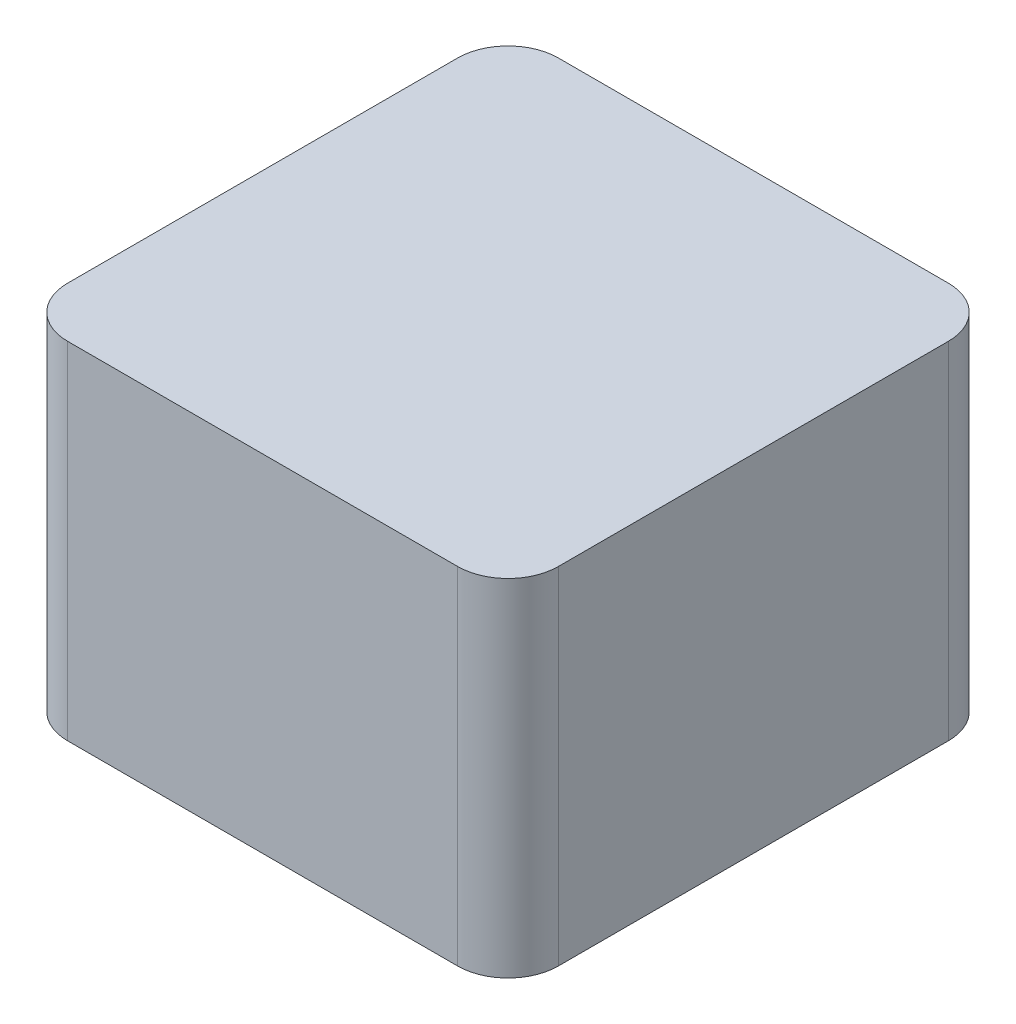
ISO-10303-21;
HEADER;
FILE_DESCRIPTION(('STEP AP214'),'2;1');
FILE_NAME('part.step','',(''),(''),'','','');
FILE_SCHEMA(('AUTOMOTIVE_DESIGN { 1 0 10303 214 1 1 1 1 }'));
ENDSEC;
DATA;
#1=APPLICATION_CONTEXT('core data for automotive mechanical design processes');
#2=APPLICATION_PROTOCOL_DEFINITION('international standard','automotive_design',2000,#1);
#3=PRODUCT_CONTEXT('',#1,'mechanical');
#4=PRODUCT('Part','Part','',(#3));
#5=PRODUCT_RELATED_PRODUCT_CATEGORY('part','',(#4));
#6=PRODUCT_DEFINITION_FORMATION('','',#4);
#7=PRODUCT_DEFINITION_CONTEXT('part definition',#1,'design');
#8=PRODUCT_DEFINITION('design','',#6,#7);
#9=PRODUCT_DEFINITION_SHAPE('','',#8);
#10=(LENGTH_UNIT() NAMED_UNIT(*) SI_UNIT(.MILLI.,.METRE.));
#11=(NAMED_UNIT(*) PLANE_ANGLE_UNIT() SI_UNIT($,.RADIAN.));
#12=(NAMED_UNIT(*) SI_UNIT($,.STERADIAN.) SOLID_ANGLE_UNIT());
#13=UNCERTAINTY_MEASURE_WITH_UNIT(LENGTH_MEASURE(1.E-05),#10,'distance_accuracy_value','');
#14=(GEOMETRIC_REPRESENTATION_CONTEXT(3) GLOBAL_UNCERTAINTY_ASSIGNED_CONTEXT((#13)) GLOBAL_UNIT_ASSIGNED_CONTEXT((#10,
#11,#12)) REPRESENTATION_CONTEXT('',''));
#15=CARTESIAN_POINT('',(0.,0.,0.));
#16=DIRECTION('',(0.,0.,1.));
#17=DIRECTION('',(1.,0.,0.));
#18=AXIS2_PLACEMENT_3D('',#15,#16,#17);
#19=CARTESIAN_POINT('',(81.7763790889018,128.224152421526,210.74612664294));
#20=DIRECTION('',(0.,-1.,0.));
#21=DIRECTION('',(0.,0.,-1.));
#22=AXIS2_PLACEMENT_3D('',#19,#20,#21);
#23=CYLINDRICAL_SURFACE('',#22,0.799999999999995);
#24=CARTESIAN_POINT('',(81.7763790889018,122.724152421526,210.74612664294));
#25=DIRECTION('',(0.,-1.,0.));
#26=DIRECTION('',(0.,0.,-1.));
#27=AXIS2_PLACEMENT_3D('',#24,#25,#26);
#28=CIRCLE('',#27,0.799999999999995);
#29=CARTESIAN_POINT('',(80.9763790889018,122.724152421526,210.74612664294));
#30=VERTEX_POINT('',#29);
#31=CARTESIAN_POINT('',(81.7763790889018,122.724152421526,209.94612664294));
#32=VERTEX_POINT('',#31);
#33=EDGE_CURVE('E142',#30,#32,#28,.T.);
#34=ORIENTED_EDGE('',*,*,#33,.F.);
#35=DIRECTION('',(0.,-1.,0.));
#36=VECTOR('',#35,1.);
#37=CARTESIAN_POINT('',(80.9763790889018,128.224152421526,210.74612664294));
#38=LINE('',#37,#36);
#39=CARTESIAN_POINT('',(80.9763790889018,128.224152421526,210.74612664294));
#40=VERTEX_POINT('',#39);
#41=EDGE_CURVE('E11',#40,#30,#38,.T.);
#42=ORIENTED_EDGE('',*,*,#41,.F.);
#43=CARTESIAN_POINT('',(81.7763790889018,128.224152421526,210.74612664294));
#44=DIRECTION('',(0.,-1.,0.));
#45=DIRECTION('',(0.,0.,-1.));
#46=AXIS2_PLACEMENT_3D('',#43,#44,#45);
#47=CIRCLE('',#46,0.799999999999995);
#48=CARTESIAN_POINT('',(81.7763790889018,128.224152421526,209.94612664294));
#49=VERTEX_POINT('',#48);
#50=EDGE_CURVE('E170',#40,#49,#47,.T.);
#51=ORIENTED_EDGE('',*,*,#50,.T.);
#52=DIRECTION('',(0.,-1.,0.));
#53=VECTOR('',#52,1.);
#54=CARTESIAN_POINT('',(81.7763790889018,128.224152421526,209.94612664294));
#55=LINE('',#54,#53);
#56=EDGE_CURVE('E42',#49,#32,#55,.T.);
#57=ORIENTED_EDGE('',*,*,#56,.T.);
#58=EDGE_LOOP('',(#34,#42,#51,#57));
#59=FACE_BOUND('',#58,.T.);
#60=ADVANCED_FACE('F39',(#59),#23,.T.);
#61=CARTESIAN_POINT('',(80.9763790889018,128.224152421526,210.74612664294));
#62=DIRECTION('',(-1.,0.,0.));
#63=DIRECTION('',(0.,0.,1.));
#64=AXIS2_PLACEMENT_3D('',#61,#62,#63);
#65=PLANE('',#64);
#66=DIRECTION('',(0.,0.,-1.));
#67=VECTOR('',#66,1.);
#68=CARTESIAN_POINT('',(80.9763790889018,122.724152421526,210.74612664294));
#69=LINE('',#68,#67);
#70=CARTESIAN_POINT('',(80.9763790889018,122.724152421526,216.94612664294));
#71=VERTEX_POINT('',#70);
#72=EDGE_CURVE('E167',#71,#30,#69,.T.);
#73=ORIENTED_EDGE('',*,*,#72,.F.);
#74=DIRECTION('',(0.,-1.,0.));
#75=VECTOR('',#74,1.);
#76=CARTESIAN_POINT('',(80.9763790889018,128.224152421526,216.94612664294));
#77=LINE('',#76,#75);
#78=CARTESIAN_POINT('',(80.9763790889018,128.224152421526,216.94612664294));
#79=VERTEX_POINT('',#78);
#80=EDGE_CURVE('E49',#79,#71,#77,.T.);
#81=ORIENTED_EDGE('',*,*,#80,.F.);
#82=DIRECTION('',(0.,0.,-1.));
#83=VECTOR('',#82,1.);
#84=CARTESIAN_POINT('',(80.9763790889018,128.224152421526,210.74612664294));
#85=LINE('',#84,#83);
#86=EDGE_CURVE('E128',#79,#40,#85,.T.);
#87=ORIENTED_EDGE('',*,*,#86,.T.);
#88=ORIENTED_EDGE('',*,*,#41,.T.);
#89=EDGE_LOOP('',(#73,#81,#87,#88));
#90=FACE_BOUND('',#89,.T.);
#91=ADVANCED_FACE('F188',(#90),#65,.T.);
#92=CARTESIAN_POINT('',(81.7763790889017,128.224152421526,216.94612664294));
#93=DIRECTION('',(0.,-1.,0.));
#94=DIRECTION('',(0.,0.,-1.));
#95=AXIS2_PLACEMENT_3D('',#92,#93,#94);
#96=CYLINDRICAL_SURFACE('',#95,0.799999999999988);
#97=CARTESIAN_POINT('',(81.7763790889017,122.724152421526,216.94612664294));
#98=DIRECTION('',(0.,-1.,0.));
#99=DIRECTION('',(0.,0.,-1.));
#100=AXIS2_PLACEMENT_3D('',#97,#98,#99);
#101=CIRCLE('',#100,0.799999999999988);
#102=CARTESIAN_POINT('',(81.7763790889017,122.724152421526,217.74612664294));
#103=VERTEX_POINT('',#102);
#104=EDGE_CURVE('E114',#103,#71,#101,.T.);
#105=ORIENTED_EDGE('',*,*,#104,.F.);
#106=DIRECTION('',(0.,-1.,0.));
#107=VECTOR('',#106,1.);
#108=CARTESIAN_POINT('',(81.7763790889017,128.224152421526,217.74612664294));
#109=LINE('',#108,#107);
#110=CARTESIAN_POINT('',(81.7763790889017,128.224152421526,217.74612664294));
#111=VERTEX_POINT('',#110);
#112=EDGE_CURVE('E109',#111,#103,#109,.T.);
#113=ORIENTED_EDGE('',*,*,#112,.F.);
#114=CARTESIAN_POINT('',(81.7763790889017,128.224152421526,216.94612664294));
#115=DIRECTION('',(0.,-1.,0.));
#116=DIRECTION('',(0.,0.,-1.));
#117=AXIS2_PLACEMENT_3D('',#114,#115,#116);
#118=CIRCLE('',#117,0.799999999999988);
#119=EDGE_CURVE('E112',#111,#79,#118,.T.);
#120=ORIENTED_EDGE('',*,*,#119,.T.);
#121=ORIENTED_EDGE('',*,*,#80,.T.);
#122=EDGE_LOOP('',(#105,#113,#120,#121));
#123=FACE_BOUND('',#122,.T.);
#124=ADVANCED_FACE('F111',(#123),#96,.T.);
#125=CARTESIAN_POINT('',(81.7763790889017,128.224152421526,217.74612664294));
#126=DIRECTION('',(0.,0.,1.));
#127=DIRECTION('',(1.,0.,0.));
#128=AXIS2_PLACEMENT_3D('',#125,#126,#127);
#129=PLANE('',#128);
#130=DIRECTION('',(-1.,0.,0.));
#131=VECTOR('',#130,1.);
#132=CARTESIAN_POINT('',(81.7763790889017,122.724152421526,217.74612664294));
#133=LINE('',#132,#131);
#134=CARTESIAN_POINT('',(87.9763790889018,122.724152421526,217.74612664294));
#135=VERTEX_POINT('',#134);
#136=EDGE_CURVE('E162',#135,#103,#133,.T.);
#137=ORIENTED_EDGE('',*,*,#136,.F.);
#138=DIRECTION('',(0.,-1.,0.));
#139=VECTOR('',#138,1.);
#140=CARTESIAN_POINT('',(87.9763790889018,128.224152421526,217.74612664294));
#141=LINE('',#140,#139);
#142=CARTESIAN_POINT('',(87.9763790889018,128.224152421526,217.74612664294));
#143=VERTEX_POINT('',#142);
#144=EDGE_CURVE('E120',#143,#135,#141,.T.);
#145=ORIENTED_EDGE('',*,*,#144,.F.);
#146=DIRECTION('',(-1.,0.,0.));
#147=VECTOR('',#146,1.);
#148=CARTESIAN_POINT('',(81.7763790889017,128.224152421526,217.74612664294));
#149=LINE('',#148,#147);
#150=EDGE_CURVE('E126',#143,#111,#149,.T.);
#151=ORIENTED_EDGE('',*,*,#150,.T.);
#152=ORIENTED_EDGE('',*,*,#112,.T.);
#153=EDGE_LOOP('',(#137,#145,#151,#152));
#154=FACE_BOUND('',#153,.T.);
#155=ADVANCED_FACE('F131',(#154),#129,.T.);
#156=CARTESIAN_POINT('',(87.9763790889018,128.224152421526,216.94612664294));
#157=DIRECTION('',(0.,-1.,0.));
#158=DIRECTION('',(0.,0.,-1.));
#159=AXIS2_PLACEMENT_3D('',#156,#157,#158);
#160=CYLINDRICAL_SURFACE('',#159,0.799999999999995);
#161=CARTESIAN_POINT('',(87.9763790889018,122.724152421526,216.94612664294));
#162=DIRECTION('',(0.,-1.,0.));
#163=DIRECTION('',(0.,0.,-1.));
#164=AXIS2_PLACEMENT_3D('',#161,#162,#163);
#165=CIRCLE('',#164,0.799999999999995);
#166=CARTESIAN_POINT('',(88.7763790889017,122.724152421526,216.94612664294));
#167=VERTEX_POINT('',#166);
#168=EDGE_CURVE('E158',#167,#135,#165,.T.);
#169=ORIENTED_EDGE('',*,*,#168,.F.);
#170=DIRECTION('',(0.,-1.,0.));
#171=VECTOR('',#170,1.);
#172=CARTESIAN_POINT('',(88.7763790889017,128.224152421526,216.94612664294));
#173=LINE('',#172,#171);
#174=CARTESIAN_POINT('',(88.7763790889017,128.224152421526,216.94612664294));
#175=VERTEX_POINT('',#174);
#176=EDGE_CURVE('E176',#175,#167,#173,.T.);
#177=ORIENTED_EDGE('',*,*,#176,.F.);
#178=CARTESIAN_POINT('',(87.9763790889018,128.224152421526,216.94612664294));
#179=DIRECTION('',(0.,-1.,0.));
#180=DIRECTION('',(0.,0.,-1.));
#181=AXIS2_PLACEMENT_3D('',#178,#179,#180);
#182=CIRCLE('',#181,0.799999999999995);
#183=EDGE_CURVE('E133',#175,#143,#182,.T.);
#184=ORIENTED_EDGE('',*,*,#183,.T.);
#185=ORIENTED_EDGE('',*,*,#144,.T.);
#186=EDGE_LOOP('',(#169,#177,#184,#185));
#187=FACE_BOUND('',#186,.T.);
#188=ADVANCED_FACE('F201',(#187),#160,.T.);
#189=CARTESIAN_POINT('',(88.7763790889017,128.224152421526,216.94612664294));
#190=DIRECTION('',(1.,0.,0.));
#191=DIRECTION('',(0.,0.,-1.));
#192=AXIS2_PLACEMENT_3D('',#189,#190,#191);
#193=PLANE('',#192);
#194=DIRECTION('',(0.,0.,1.));
#195=VECTOR('',#194,1.);
#196=CARTESIAN_POINT('',(88.7763790889017,122.724152421526,216.94612664294));
#197=LINE('',#196,#195);
#198=CARTESIAN_POINT('',(88.7763790889017,122.724152421526,210.74612664294));
#199=VERTEX_POINT('',#198);
#200=EDGE_CURVE('E154',#199,#167,#197,.T.);
#201=ORIENTED_EDGE('',*,*,#200,.F.);
#202=DIRECTION('',(0.,-1.,0.));
#203=VECTOR('',#202,1.);
#204=CARTESIAN_POINT('',(88.7763790889017,128.224152421526,210.74612664294));
#205=LINE('',#204,#203);
#206=CARTESIAN_POINT('',(88.7763790889017,128.224152421526,210.74612664294));
#207=VERTEX_POINT('',#206);
#208=EDGE_CURVE('E179',#207,#199,#205,.T.);
#209=ORIENTED_EDGE('',*,*,#208,.F.);
#210=DIRECTION('',(0.,0.,1.));
#211=VECTOR('',#210,1.);
#212=CARTESIAN_POINT('',(88.7763790889017,128.224152421526,216.94612664294));
#213=LINE('',#212,#211);
#214=EDGE_CURVE('E136',#207,#175,#213,.T.);
#215=ORIENTED_EDGE('',*,*,#214,.T.);
#216=ORIENTED_EDGE('',*,*,#176,.T.);
#217=EDGE_LOOP('',(#201,#209,#215,#216));
#218=FACE_BOUND('',#217,.T.);
#219=ADVANCED_FACE('F204',(#218),#193,.T.);
#220=CARTESIAN_POINT('',(87.9763790889017,128.224152421526,210.74612664294));
#221=DIRECTION('',(0.,-1.,0.));
#222=DIRECTION('',(0.,0.,-1.));
#223=AXIS2_PLACEMENT_3D('',#220,#221,#222);
#224=CYLINDRICAL_SURFACE('',#223,0.799999999999995);
#225=CARTESIAN_POINT('',(87.9763790889017,122.724152421526,210.74612664294));
#226=DIRECTION('',(0.,-1.,0.));
#227=DIRECTION('',(0.,0.,-1.));
#228=AXIS2_PLACEMENT_3D('',#225,#226,#227);
#229=CIRCLE('',#228,0.799999999999995);
#230=CARTESIAN_POINT('',(87.9763790889017,122.724152421526,209.94612664294));
#231=VERTEX_POINT('',#230);
#232=EDGE_CURVE('E150',#231,#199,#229,.T.);
#233=ORIENTED_EDGE('',*,*,#232,.F.);
#234=DIRECTION('',(0.,-1.,0.));
#235=VECTOR('',#234,1.);
#236=CARTESIAN_POINT('',(87.9763790889017,128.224152421526,209.94612664294));
#237=LINE('',#236,#235);
#238=CARTESIAN_POINT('',(87.9763790889017,128.224152421526,209.94612664294));
#239=VERTEX_POINT('',#238);
#240=EDGE_CURVE('E181',#239,#231,#237,.T.);
#241=ORIENTED_EDGE('',*,*,#240,.F.);
#242=CARTESIAN_POINT('',(87.9763790889017,128.224152421526,210.74612664294));
#243=DIRECTION('',(0.,-1.,0.));
#244=DIRECTION('',(0.,0.,-1.));
#245=AXIS2_PLACEMENT_3D('',#242,#243,#244);
#246=CIRCLE('',#245,0.799999999999995);
#247=EDGE_CURVE('E279',#239,#207,#246,.T.);
#248=ORIENTED_EDGE('',*,*,#247,.T.);
#249=ORIENTED_EDGE('',*,*,#208,.T.);
#250=EDGE_LOOP('',(#233,#241,#248,#249));
#251=FACE_BOUND('',#250,.T.);
#252=ADVANCED_FACE('F208',(#251),#224,.T.);
#253=CARTESIAN_POINT('',(87.9763790889017,128.224152421526,209.94612664294));
#254=DIRECTION('',(0.,0.,-1.));
#255=DIRECTION('',(-1.,0.,0.));
#256=AXIS2_PLACEMENT_3D('',#253,#254,#255);
#257=PLANE('',#256);
#258=DIRECTION('',(1.,0.,0.));
#259=VECTOR('',#258,1.);
#260=CARTESIAN_POINT('',(87.9763790889017,122.724152421526,209.94612664294));
#261=LINE('',#260,#259);
#262=EDGE_CURVE('E146',#32,#231,#261,.T.);
#263=ORIENTED_EDGE('',*,*,#262,.F.);
#264=ORIENTED_EDGE('',*,*,#56,.F.);
#265=DIRECTION('',(1.,0.,0.));
#266=VECTOR('',#265,1.);
#267=CARTESIAN_POINT('',(87.9763790889017,128.224152421526,209.94612664294));
#268=LINE('',#267,#266);
#269=EDGE_CURVE('E282',#49,#239,#268,.T.);
#270=ORIENTED_EDGE('',*,*,#269,.T.);
#271=ORIENTED_EDGE('',*,*,#240,.T.);
#272=EDGE_LOOP('',(#263,#264,#270,#271));
#273=FACE_BOUND('',#272,.T.);
#274=ADVANCED_FACE('F185',(#273),#257,.T.);
#275=CARTESIAN_POINT('',(81.7763790889018,128.224152421526,210.74612664294));
#276=DIRECTION('',(0.,-1.,0.));
#277=DIRECTION('',(0.,0.,-1.));
#278=AXIS2_PLACEMENT_3D('',#275,#276,#277);
#279=PLANE('',#278);
#280=ORIENTED_EDGE('',*,*,#50,.F.);
#281=ORIENTED_EDGE('',*,*,#86,.F.);
#282=ORIENTED_EDGE('',*,*,#119,.F.);
#283=ORIENTED_EDGE('',*,*,#150,.F.);
#284=ORIENTED_EDGE('',*,*,#183,.F.);
#285=ORIENTED_EDGE('',*,*,#214,.F.);
#286=ORIENTED_EDGE('',*,*,#247,.F.);
#287=ORIENTED_EDGE('',*,*,#269,.F.);
#288=EDGE_LOOP('',(#280,#281,#282,#283,#284,#285,#286,#287));
#289=FACE_BOUND('',#288,.T.);
#290=ADVANCED_FACE('F124',(#289),#279,.F.);
#291=CARTESIAN_POINT('',(81.7763790889018,122.724152421526,210.74612664294));
#292=DIRECTION('',(0.,-1.,0.));
#293=DIRECTION('',(0.,0.,-1.));
#294=AXIS2_PLACEMENT_3D('',#291,#292,#293);
#295=PLANE('',#294);
#296=ORIENTED_EDGE('',*,*,#33,.T.);
#297=ORIENTED_EDGE('',*,*,#262,.T.);
#298=ORIENTED_EDGE('',*,*,#232,.T.);
#299=ORIENTED_EDGE('',*,*,#200,.T.);
#300=ORIENTED_EDGE('',*,*,#168,.T.);
#301=ORIENTED_EDGE('',*,*,#136,.T.);
#302=ORIENTED_EDGE('',*,*,#104,.T.);
#303=ORIENTED_EDGE('',*,*,#72,.T.);
#304=EDGE_LOOP('',(#296,#297,#298,#299,#300,#301,#302,#303));
#305=FACE_BOUND('',#304,.T.);
#306=ADVANCED_FACE('F187',(#305),#295,.T.);
#307=CLOSED_SHELL('',(#60,#91,#124,#155,#188,#219,#252,#274,#290,#306));
#308=MANIFOLD_SOLID_BREP('B2',#307);
#309=ADVANCED_BREP_SHAPE_REPRESENTATION('',(#18,#308),#14);
#310=SHAPE_DEFINITION_REPRESENTATION(#9,#309);
ENDSEC;
END-ISO-10303-21;
